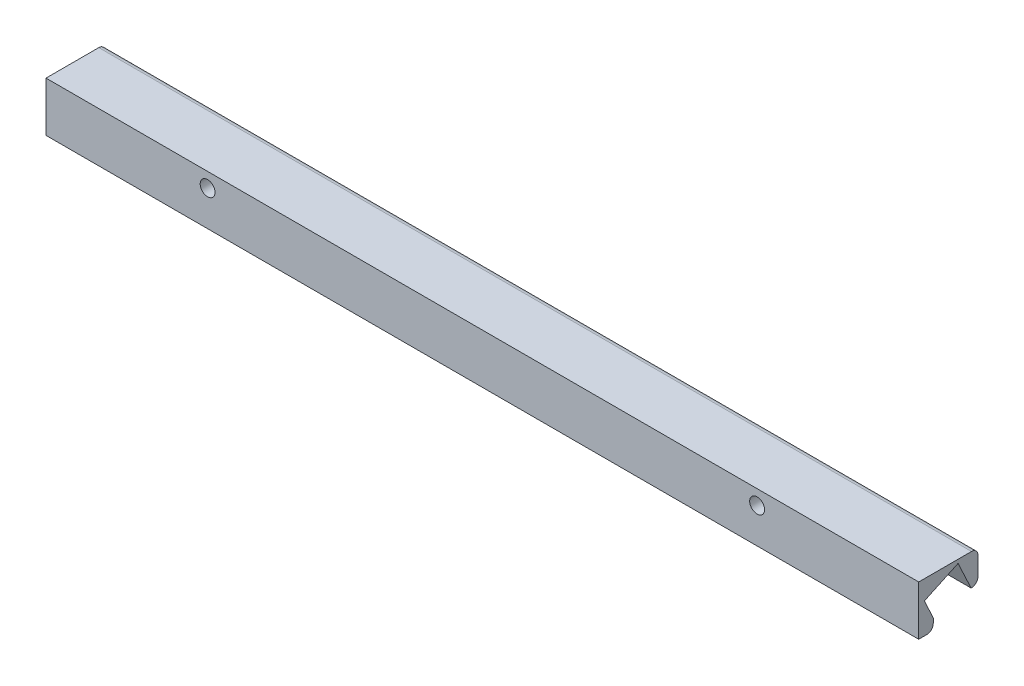
ISO-10303-21;
HEADER;
FILE_DESCRIPTION(('STEP AP214'),'2;1');
FILE_NAME('part.step','',(''),(''),'','','');
FILE_SCHEMA(('AUTOMOTIVE_DESIGN { 1 0 10303 214 1 1 1 1 }'));
ENDSEC;
DATA;
#1=APPLICATION_CONTEXT('core data for automotive mechanical design processes');
#2=APPLICATION_PROTOCOL_DEFINITION('international standard','automotive_design',2000,#1);
#3=PRODUCT_CONTEXT('',#1,'mechanical');
#4=PRODUCT('Part','Part','',(#3));
#5=PRODUCT_RELATED_PRODUCT_CATEGORY('part','',(#4));
#6=PRODUCT_DEFINITION_FORMATION('','',#4);
#7=PRODUCT_DEFINITION_CONTEXT('part definition',#1,'design');
#8=PRODUCT_DEFINITION('design','',#6,#7);
#9=PRODUCT_DEFINITION_SHAPE('','',#8);
#10=(LENGTH_UNIT() NAMED_UNIT(*) SI_UNIT(.MILLI.,.METRE.));
#11=(NAMED_UNIT(*) PLANE_ANGLE_UNIT() SI_UNIT($,.RADIAN.));
#12=(NAMED_UNIT(*) SI_UNIT($,.STERADIAN.) SOLID_ANGLE_UNIT());
#13=UNCERTAINTY_MEASURE_WITH_UNIT(LENGTH_MEASURE(1.E-05),#10,'distance_accuracy_value','');
#14=(GEOMETRIC_REPRESENTATION_CONTEXT(3) GLOBAL_UNCERTAINTY_ASSIGNED_CONTEXT((#13)) GLOBAL_UNIT_ASSIGNED_CONTEXT((#10,
#11,#12)) REPRESENTATION_CONTEXT('',''));
#15=CARTESIAN_POINT('',(0.,0.,0.));
#16=DIRECTION('',(0.,0.,1.));
#17=DIRECTION('',(1.,0.,0.));
#18=AXIS2_PLACEMENT_3D('',#15,#16,#17);
#19=CARTESIAN_POINT('',(270.,15.360110010018,0.));
#20=DIRECTION('',(0.,0.,-1.));
#21=DIRECTION('',(0.,1.,0.));
#22=AXIS2_PLACEMENT_3D('',#19,#20,#21);
#23=PLANE('',#22);
#24=CARTESIAN_POINT('',(50.,10.860110010018,0.));
#25=DIRECTION('',(0.,0.,1.));
#26=DIRECTION('',(1.,0.,0.));
#27=AXIS2_PLACEMENT_3D('',#24,#25,#26);
#28=CIRCLE('',#27,2.3);
#29=CARTESIAN_POINT('',(52.3,10.860110010018,0.));
#30=VERTEX_POINT('',#29);
#31=EDGE_CURVE('E201',#30,#30,#28,.T.);
#32=ORIENTED_EDGE('',*,*,#31,.F.);
#33=EDGE_LOOP('',(#32));
#34=FACE_BOUND('',#33,.T.);
#35=CARTESIAN_POINT('',(220.,10.860110010018,0.));
#36=DIRECTION('',(0.,0.,1.));
#37=DIRECTION('',(1.,0.,0.));
#38=AXIS2_PLACEMENT_3D('',#35,#36,#37);
#39=CIRCLE('',#38,2.30000000000003);
#40=CARTESIAN_POINT('',(222.3,10.860110010018,0.));
#41=VERTEX_POINT('',#40);
#42=EDGE_CURVE('E204',#41,#41,#39,.T.);
#43=ORIENTED_EDGE('',*,*,#42,.F.);
#44=EDGE_LOOP('',(#43));
#45=FACE_BOUND('',#44,.T.);
#46=DIRECTION('',(0.,-1.,0.));
#47=VECTOR('',#46,1.);
#48=CARTESIAN_POINT('',(0.,15.360110010018,0.));
#49=LINE('',#48,#47);
#50=CARTESIAN_POINT('',(0.,15.360110010018,0.));
#51=VERTEX_POINT('',#50);
#52=CARTESIAN_POINT('',(0.,0.,0.));
#53=VERTEX_POINT('',#52);
#54=EDGE_CURVE('E212',#51,#53,#49,.T.);
#55=ORIENTED_EDGE('',*,*,#54,.T.);
#56=DIRECTION('',(-1.,0.,0.));
#57=VECTOR('',#56,1.);
#58=CARTESIAN_POINT('',(270.,0.,0.));
#59=LINE('',#58,#57);
#60=CARTESIAN_POINT('',(270.,0.,0.));
#61=VERTEX_POINT('',#60);
#62=EDGE_CURVE('E11',#61,#53,#59,.T.);
#63=ORIENTED_EDGE('',*,*,#62,.F.);
#64=DIRECTION('',(0.,-1.,0.));
#65=VECTOR('',#64,1.);
#66=CARTESIAN_POINT('',(270.,15.360110010018,0.));
#67=LINE('',#66,#65);
#68=CARTESIAN_POINT('',(270.,15.360110010018,0.));
#69=VERTEX_POINT('',#68);
#70=EDGE_CURVE('E221',#69,#61,#67,.T.);
#71=ORIENTED_EDGE('',*,*,#70,.F.);
#72=DIRECTION('',(-1.,0.,0.));
#73=VECTOR('',#72,1.);
#74=CARTESIAN_POINT('',(270.,15.360110010018,0.));
#75=LINE('',#74,#73);
#76=EDGE_CURVE('E241',#69,#51,#75,.T.);
#77=ORIENTED_EDGE('',*,*,#76,.T.);
#78=EDGE_LOOP('',(#55,#63,#71,#77));
#79=FACE_BOUND('',#78,.T.);
#80=ADVANCED_FACE('F39',(#34,#45,#79),#23,.F.);
#81=CARTESIAN_POINT('',(270.,0.,0.));
#82=DIRECTION('',(0.,1.,0.));
#83=DIRECTION('',(0.,0.,1.));
#84=AXIS2_PLACEMENT_3D('',#81,#82,#83);
#85=PLANE('',#84);
#86=DIRECTION('',(0.,0.,-1.));
#87=VECTOR('',#86,1.);
#88=CARTESIAN_POINT('',(0.,0.,0.));
#89=LINE('',#88,#87);
#90=CARTESIAN_POINT('',(0.,0.,-2.4994615533352));
#91=VERTEX_POINT('',#90);
#92=EDGE_CURVE('E244',#53,#91,#89,.T.);
#93=ORIENTED_EDGE('',*,*,#92,.T.);
#94=DIRECTION('',(-1.,0.,0.));
#95=VECTOR('',#94,1.);
#96=CARTESIAN_POINT('',(270.,0.,-2.4994615533352));
#97=LINE('',#96,#95);
#98=CARTESIAN_POINT('',(270.,0.,-2.4994615533352));
#99=VERTEX_POINT('',#98);
#100=EDGE_CURVE('E46',#99,#91,#97,.T.);
#101=ORIENTED_EDGE('',*,*,#100,.F.);
#102=DIRECTION('',(0.,0.,-1.));
#103=VECTOR('',#102,1.);
#104=CARTESIAN_POINT('',(270.,0.,0.));
#105=LINE('',#104,#103);
#106=EDGE_CURVE('E224',#61,#99,#105,.T.);
#107=ORIENTED_EDGE('',*,*,#106,.F.);
#108=ORIENTED_EDGE('',*,*,#62,.T.);
#109=EDGE_LOOP('',(#93,#101,#107,#108));
#110=FACE_BOUND('',#109,.T.);
#111=ADVANCED_FACE('F307',(#110),#85,.F.);
#112=CARTESIAN_POINT('',(270.,2.0005384466648,-2.4994615533352));
#113=DIRECTION('',(-1.,0.,0.));
#114=DIRECTION('',(0.,0.,1.));
#115=AXIS2_PLACEMENT_3D('',#112,#113,#114);
#116=CYLINDRICAL_SURFACE('',#115,2.0005384466648);
#117=CARTESIAN_POINT('',(0.,2.0005384466648,-2.4994615533352));
#118=DIRECTION('',(1.,0.,0.));
#119=DIRECTION('',(0.,0.,-1.));
#120=AXIS2_PLACEMENT_3D('',#117,#118,#119);
#121=CIRCLE('',#120,2.0005384466648);
#122=CARTESIAN_POINT('',(0.,2.0005384466648,-4.5));
#123=VERTEX_POINT('',#122);
#124=EDGE_CURVE('E246',#91,#123,#121,.T.);
#125=ORIENTED_EDGE('',*,*,#124,.T.);
#126=DIRECTION('',(-1.,0.,0.));
#127=VECTOR('',#126,1.);
#128=CARTESIAN_POINT('',(270.,2.0005384466648,-4.5));
#129=LINE('',#128,#127);
#130=CARTESIAN_POINT('',(270.,2.0005384466648,-4.5));
#131=VERTEX_POINT('',#130);
#132=EDGE_CURVE('E280',#131,#123,#129,.T.);
#133=ORIENTED_EDGE('',*,*,#132,.F.);
#134=CARTESIAN_POINT('',(270.,2.0005384466648,-2.4994615533352));
#135=DIRECTION('',(1.,0.,0.));
#136=DIRECTION('',(0.,0.,-1.));
#137=AXIS2_PLACEMENT_3D('',#134,#135,#136);
#138=CIRCLE('',#137,2.0005384466648);
#139=EDGE_CURVE('E227',#99,#131,#138,.T.);
#140=ORIENTED_EDGE('',*,*,#139,.F.);
#141=ORIENTED_EDGE('',*,*,#100,.T.);
#142=EDGE_LOOP('',(#125,#133,#140,#141));
#143=FACE_BOUND('',#142,.T.);
#144=ADVANCED_FACE('F287',(#143),#116,.T.);
#145=CARTESIAN_POINT('',(270.,3.5,-4.5));
#146=DIRECTION('',(0.,0.,1.));
#147=DIRECTION('',(0.,-1.,0.));
#148=AXIS2_PLACEMENT_3D('',#145,#146,#147);
#149=PLANE('',#148);
#150=DIRECTION('',(0.,1.,0.));
#151=VECTOR('',#150,1.);
#152=CARTESIAN_POINT('',(0.,3.5,-4.5));
#153=LINE('',#152,#151);
#154=CARTESIAN_POINT('',(0.,3.5,-4.5));
#155=VERTEX_POINT('',#154);
#156=EDGE_CURVE('E248',#123,#155,#153,.T.);
#157=ORIENTED_EDGE('',*,*,#156,.T.);
#158=DIRECTION('',(-1.,0.,0.));
#159=VECTOR('',#158,1.);
#160=CARTESIAN_POINT('',(0.,3.5,-4.5));
#161=LINE('',#160,#159);
#162=CARTESIAN_POINT('',(28.,3.5,-4.5));
#163=VERTEX_POINT('',#162);
#164=EDGE_CURVE('E185',#163,#155,#161,.T.);
#165=ORIENTED_EDGE('',*,*,#164,.F.);
#166=DIRECTION('',(-1.,0.,0.));
#167=VECTOR('',#166,1.);
#168=CARTESIAN_POINT('',(270.,3.5,-4.5));
#169=LINE('',#168,#167);
#170=CARTESIAN_POINT('',(242.,3.5,-4.5));
#171=VERTEX_POINT('',#170);
#172=EDGE_CURVE('E276',#171,#163,#169,.T.);
#173=ORIENTED_EDGE('',*,*,#172,.F.);
#174=CARTESIAN_POINT('',(270.,3.5,-4.5));
#175=VERTEX_POINT('',#174);
#176=EDGE_CURVE('E277',#175,#171,#169,.T.);
#177=ORIENTED_EDGE('',*,*,#176,.F.);
#178=DIRECTION('',(0.,1.,0.));
#179=VECTOR('',#178,1.);
#180=CARTESIAN_POINT('',(270.,3.5,-4.5));
#181=LINE('',#180,#179);
#182=EDGE_CURVE('E229',#131,#175,#181,.T.);
#183=ORIENTED_EDGE('',*,*,#182,.F.);
#184=ORIENTED_EDGE('',*,*,#132,.T.);
#185=EDGE_LOOP('',(#157,#165,#173,#177,#183,#184));
#186=FACE_BOUND('',#185,.T.);
#187=ADVANCED_FACE('F297',(#186),#149,.F.);
#188=CARTESIAN_POINT('',(270.,8.36011001001802,-14.9225395509215));
#189=DIRECTION('',(0.,0.906307787036651,0.422618261740697));
#190=DIRECTION('',(0.,-0.422618261740697,0.906307787036651));
#191=AXIS2_PLACEMENT_3D('',#188,#189,#190);
#192=PLANE('',#191);
#193=CARTESIAN_POINT('',(36.15,5.16401056189004,-8.0684821657742));
#194=DIRECTION('',(0.,-0.906307787036651,-0.422618261740697));
#195=DIRECTION('',(0.,0.422618261740697,-0.906307787036651));
#196=AXIS2_PLACEMENT_3D('',#193,#194,#195);
#197=CIRCLE('',#196,2.3);
#198=CARTESIAN_POINT('',(36.15,6.13603256389364,-10.1529900759585));
#199=VERTEX_POINT('',#198);
#200=EDGE_CURVE('E213',#199,#199,#197,.T.);
#201=ORIENTED_EDGE('',*,*,#200,.F.);
#202=EDGE_LOOP('',(#201));
#203=FACE_BOUND('',#202,.T.);
#204=CARTESIAN_POINT('',(233.85,5.93005500500901,-9.71126977546074));
#205=DIRECTION('',(0.,-0.906307787036651,-0.422618261740697));
#206=DIRECTION('',(0.,0.422618261740697,-0.906307787036651));
#207=AXIS2_PLACEMENT_3D('',#204,#205,#206);
#208=CIRCLE('',#207,2.30000000000003);
#209=CARTESIAN_POINT('',(233.85,6.90207700701263,-11.7957776856451));
#210=VERTEX_POINT('',#209);
#211=EDGE_CURVE('E216',#210,#210,#208,.T.);
#212=ORIENTED_EDGE('',*,*,#211,.F.);
#213=EDGE_LOOP('',(#212));
#214=FACE_BOUND('',#213,.T.);
#215=DIRECTION('',(-1.,0.,0.));
#216=VECTOR('',#215,1.);
#217=CARTESIAN_POINT('',(270.,8.36011001001802,-14.9225395509215));
#218=LINE('',#217,#216);
#219=CARTESIAN_POINT('',(242.,8.36011001001802,-14.9225395509215));
#220=VERTEX_POINT('',#219);
#221=CARTESIAN_POINT('',(28.,8.36011001001802,-14.9225395509215));
#222=VERTEX_POINT('',#221);
#223=EDGE_CURVE('E274',#220,#222,#218,.T.);
#224=ORIENTED_EDGE('',*,*,#223,.F.);
#225=DIRECTION('',(0.,0.422618261740697,-0.906307787036651));
#226=VECTOR('',#225,1.);
#227=CARTESIAN_POINT('',(242.,3.5,-4.5));
#228=LINE('',#227,#226);
#229=EDGE_CURVE('E154',#171,#220,#228,.T.);
#230=ORIENTED_EDGE('',*,*,#229,.F.);
#231=ORIENTED_EDGE('',*,*,#172,.T.);
#232=DIRECTION('',(0.,-0.422618261740697,0.906307787036651));
#233=VECTOR('',#232,1.);
#234=CARTESIAN_POINT('',(28.,3.5,-4.5));
#235=LINE('',#234,#233);
#236=EDGE_CURVE('E169',#222,#163,#235,.T.);
#237=ORIENTED_EDGE('',*,*,#236,.F.);
#238=EDGE_LOOP('',(#224,#230,#231,#237));
#239=FACE_BOUND('',#238,.T.);
#240=ADVANCED_FACE('F399',(#203,#214,#239),#192,.F.);
#241=CARTESIAN_POINT('',(270.,5.64118664890806,-16.1903943361436));
#242=DIRECTION('',(0.,0.422618261740698,-0.906307787036651));
#243=DIRECTION('',(0.,0.906307787036651,0.422618261740698));
#244=AXIS2_PLACEMENT_3D('',#241,#242,#243);
#245=PLANE('',#244);
#246=DIRECTION('',(0.,-0.906307787036651,-0.422618261740698));
#247=VECTOR('',#246,1.);
#248=CARTESIAN_POINT('',(0.,5.64118664890806,-16.1903943361436));
#249=LINE('',#248,#247);
#250=CARTESIAN_POINT('',(0.,14.2511106257563,-12.175520849607));
#251=VERTEX_POINT('',#250);
#252=CARTESIAN_POINT('',(0.,5.64118664890806,-16.1903943361436));
#253=VERTEX_POINT('',#252);
#254=EDGE_CURVE('E251',#251,#253,#249,.T.);
#255=ORIENTED_EDGE('',*,*,#254,.T.);
#256=DIRECTION('',(-1.,0.,0.));
#257=VECTOR('',#256,1.);
#258=CARTESIAN_POINT('',(270.,5.64118664890806,-16.1903943361436));
#259=LINE('',#258,#257);
#260=CARTESIAN_POINT('',(270.,5.64118664890806,-16.1903943361436));
#261=VERTEX_POINT('',#260);
#262=EDGE_CURVE('E271',#261,#253,#259,.T.);
#263=ORIENTED_EDGE('',*,*,#262,.F.);
#264=DIRECTION('',(0.,-0.906307787036651,-0.422618261740698));
#265=VECTOR('',#264,1.);
#266=CARTESIAN_POINT('',(270.,5.64118664890806,-16.1903943361436));
#267=LINE('',#266,#265);
#268=CARTESIAN_POINT('',(270.,14.2511106257563,-12.175520849607));
#269=VERTEX_POINT('',#268);
#270=EDGE_CURVE('E53',#269,#261,#267,.T.);
#271=ORIENTED_EDGE('',*,*,#270,.F.);
#272=DIRECTION('',(1.,0.,0.));
#273=VECTOR('',#272,1.);
#274=CARTESIAN_POINT('',(242.,14.2511106257563,-12.175520849607));
#275=LINE('',#274,#273);
#276=CARTESIAN_POINT('',(242.,14.2511106257563,-12.175520849607));
#277=VERTEX_POINT('',#276);
#278=EDGE_CURVE('E160',#277,#269,#275,.T.);
#279=ORIENTED_EDGE('',*,*,#278,.F.);
#280=DIRECTION('',(0.,-0.906307787036651,-0.422618261740697));
#281=VECTOR('',#280,1.);
#282=CARTESIAN_POINT('',(242.,14.2511106257563,-12.175520849607));
#283=LINE('',#282,#281);
#284=EDGE_CURVE('E148',#277,#220,#283,.T.);
#285=ORIENTED_EDGE('',*,*,#284,.T.);
#286=ORIENTED_EDGE('',*,*,#223,.T.);
#287=DIRECTION('',(0.,-0.906307787036651,-0.422618261740697));
#288=VECTOR('',#287,1.);
#289=CARTESIAN_POINT('',(28.,14.2511106257563,-12.175520849607));
#290=LINE('',#289,#288);
#291=CARTESIAN_POINT('',(28.,14.2511106257563,-12.175520849607));
#292=VERTEX_POINT('',#291);
#293=EDGE_CURVE('E178',#292,#222,#290,.T.);
#294=ORIENTED_EDGE('',*,*,#293,.F.);
#295=DIRECTION('',(1.,0.,0.));
#296=VECTOR('',#295,1.);
#297=CARTESIAN_POINT('',(0.,14.2511106257563,-12.175520849607));
#298=LINE('',#297,#296);
#299=EDGE_CURVE('E193',#251,#292,#298,.T.);
#300=ORIENTED_EDGE('',*,*,#299,.F.);
#301=EDGE_LOOP('',(#255,#263,#271,#279,#285,#286,#294,#300));
#302=FACE_BOUND('',#301,.T.);
#303=ADVANCED_FACE('F161',(#302),#245,.F.);
#304=CARTESIAN_POINT('',(270.,7.63552847711335,-16.3407295358501));
#305=DIRECTION('',(-1.,0.,0.));
#306=DIRECTION('',(0.,0.,1.));
#307=AXIS2_PLACEMENT_3D('',#304,#305,#306);
#308=CYLINDRICAL_SURFACE('',#307,2.);
#309=CARTESIAN_POINT('',(0.,7.63552847711335,-16.3407295358501));
#310=DIRECTION('',(1.,0.,0.));
#311=DIRECTION('',(0.,0.,-1.));
#312=AXIS2_PLACEMENT_3D('',#309,#310,#311);
#313=CIRCLE('',#312,2.);
#314=CARTESIAN_POINT('',(0.,7.63552847711335,-18.3407295358501));
#315=VERTEX_POINT('',#314);
#316=EDGE_CURVE('E253',#253,#315,#313,.T.);
#317=ORIENTED_EDGE('',*,*,#316,.T.);
#318=DIRECTION('',(-1.,0.,0.));
#319=VECTOR('',#318,1.);
#320=CARTESIAN_POINT('',(270.,7.63552847711335,-18.3407295358501));
#321=LINE('',#320,#319);
#322=CARTESIAN_POINT('',(270.,7.63552847711335,-18.3407295358501));
#323=VERTEX_POINT('',#322);
#324=EDGE_CURVE('E268',#323,#315,#321,.T.);
#325=ORIENTED_EDGE('',*,*,#324,.F.);
#326=CARTESIAN_POINT('',(270.,7.63552847711335,-16.3407295358501));
#327=DIRECTION('',(1.,0.,0.));
#328=DIRECTION('',(0.,0.,-1.));
#329=AXIS2_PLACEMENT_3D('',#326,#327,#328);
#330=CIRCLE('',#329,2.);
#331=EDGE_CURVE('E233',#261,#323,#330,.T.);
#332=ORIENTED_EDGE('',*,*,#331,.F.);
#333=ORIENTED_EDGE('',*,*,#262,.T.);
#334=EDGE_LOOP('',(#317,#325,#332,#333));
#335=FACE_BOUND('',#334,.T.);
#336=ADVANCED_FACE('F328',(#335),#308,.T.);
#337=CARTESIAN_POINT('',(270.,7.63552847711335,-18.3407295358501));
#338=DIRECTION('',(0.,0.,1.));
#339=DIRECTION('',(0.,-1.,0.));
#340=AXIS2_PLACEMENT_3D('',#337,#338,#339);
#341=PLANE('',#340);
#342=DIRECTION('',(0.,1.,0.));
#343=VECTOR('',#342,1.);
#344=CARTESIAN_POINT('',(0.,7.63552847711335,-18.3407295358501));
#345=LINE('',#344,#343);
#346=CARTESIAN_POINT('',(0.,13.360110010018,-18.3407295358501));
#347=VERTEX_POINT('',#346);
#348=EDGE_CURVE('E255',#315,#347,#345,.T.);
#349=ORIENTED_EDGE('',*,*,#348,.T.);
#350=DIRECTION('',(-1.,0.,0.));
#351=VECTOR('',#350,1.);
#352=CARTESIAN_POINT('',(270.,13.360110010018,-18.3407295358501));
#353=LINE('',#352,#351);
#354=CARTESIAN_POINT('',(270.,13.360110010018,-18.3407295358501));
#355=VERTEX_POINT('',#354);
#356=EDGE_CURVE('E265',#355,#347,#353,.T.);
#357=ORIENTED_EDGE('',*,*,#356,.F.);
#358=DIRECTION('',(0.,1.,0.));
#359=VECTOR('',#358,1.);
#360=CARTESIAN_POINT('',(270.,7.63552847711335,-18.3407295358501));
#361=LINE('',#360,#359);
#362=EDGE_CURVE('E235',#323,#355,#361,.T.);
#363=ORIENTED_EDGE('',*,*,#362,.F.);
#364=ORIENTED_EDGE('',*,*,#324,.T.);
#365=EDGE_LOOP('',(#349,#357,#363,#364));
#366=FACE_BOUND('',#365,.T.);
#367=ADVANCED_FACE('F323',(#366),#341,.F.);
#368=CARTESIAN_POINT('',(270.,13.360110010018,-16.3407295358501));
#369=DIRECTION('',(-1.,0.,0.));
#370=DIRECTION('',(0.,0.,1.));
#371=AXIS2_PLACEMENT_3D('',#368,#369,#370);
#372=CYLINDRICAL_SURFACE('',#371,2.);
#373=CARTESIAN_POINT('',(0.,13.360110010018,-16.3407295358501));
#374=DIRECTION('',(1.,0.,0.));
#375=DIRECTION('',(0.,0.,1.));
#376=AXIS2_PLACEMENT_3D('',#373,#374,#375);
#377=CIRCLE('',#376,2.);
#378=CARTESIAN_POINT('',(0.,15.360110010018,-16.3407295358501));
#379=VERTEX_POINT('',#378);
#380=EDGE_CURVE('E257',#347,#379,#377,.T.);
#381=ORIENTED_EDGE('',*,*,#380,.T.);
#382=DIRECTION('',(-1.,0.,0.));
#383=VECTOR('',#382,1.);
#384=CARTESIAN_POINT('',(270.,15.360110010018,-16.3407295358501));
#385=LINE('',#384,#383);
#386=CARTESIAN_POINT('',(270.,15.360110010018,-16.3407295358501));
#387=VERTEX_POINT('',#386);
#388=EDGE_CURVE('E262',#387,#379,#385,.T.);
#389=ORIENTED_EDGE('',*,*,#388,.F.);
#390=CARTESIAN_POINT('',(270.,13.360110010018,-16.3407295358501));
#391=DIRECTION('',(1.,0.,0.));
#392=DIRECTION('',(0.,0.,1.));
#393=AXIS2_PLACEMENT_3D('',#390,#391,#392);
#394=CIRCLE('',#393,2.);
#395=EDGE_CURVE('E237',#355,#387,#394,.T.);
#396=ORIENTED_EDGE('',*,*,#395,.F.);
#397=ORIENTED_EDGE('',*,*,#356,.T.);
#398=EDGE_LOOP('',(#381,#389,#396,#397));
#399=FACE_BOUND('',#398,.T.);
#400=ADVANCED_FACE('F319',(#399),#372,.T.);
#401=CARTESIAN_POINT('',(270.,15.360110010018,-16.3407295358501));
#402=DIRECTION('',(0.,-1.,0.));
#403=DIRECTION('',(0.,0.,-1.));
#404=AXIS2_PLACEMENT_3D('',#401,#402,#403);
#405=PLANE('',#404);
#406=DIRECTION('',(0.,0.,1.));
#407=VECTOR('',#406,1.);
#408=CARTESIAN_POINT('',(0.,15.360110010018,-16.3407295358501));
#409=LINE('',#408,#407);
#410=EDGE_CURVE('E225',#379,#51,#409,.T.);
#411=ORIENTED_EDGE('',*,*,#410,.T.);
#412=ORIENTED_EDGE('',*,*,#76,.F.);
#413=DIRECTION('',(0.,0.,1.));
#414=VECTOR('',#413,1.);
#415=CARTESIAN_POINT('',(270.,15.360110010018,-16.3407295358501));
#416=LINE('',#415,#414);
#417=EDGE_CURVE('E239',#387,#69,#416,.T.);
#418=ORIENTED_EDGE('',*,*,#417,.F.);
#419=ORIENTED_EDGE('',*,*,#388,.T.);
#420=EDGE_LOOP('',(#411,#412,#418,#419));
#421=FACE_BOUND('',#420,.T.);
#422=ADVANCED_FACE('F314',(#421),#405,.F.);
#423=CARTESIAN_POINT('',(270.,2.0005384466648,-2.4994615533352));
#424=DIRECTION('',(1.,0.,0.));
#425=DIRECTION('',(0.,0.,-1.));
#426=AXIS2_PLACEMENT_3D('',#423,#424,#425);
#427=PLANE('',#426);
#428=DIRECTION('',(0.,-0.906307787036651,-0.422618261740697));
#429=VECTOR('',#428,1.);
#430=CARTESIAN_POINT('',(270.,9.39100061573824,-1.75298129868547));
#431=LINE('',#430,#429);
#432=CARTESIAN_POINT('',(270.,9.39100061573824,-1.75298129868547));
#433=VERTEX_POINT('',#432);
#434=EDGE_CURVE('E157',#433,#175,#431,.T.);
#435=ORIENTED_EDGE('',*,*,#434,.F.);
#436=DIRECTION('',(0.,-0.422618261740697,0.906307787036651));
#437=VECTOR('',#436,1.);
#438=CARTESIAN_POINT('',(270.,9.39100061573824,-1.75298129868547));
#439=LINE('',#438,#437);
#440=EDGE_CURVE('E164',#269,#433,#439,.T.);
#441=ORIENTED_EDGE('',*,*,#440,.F.);
#442=ORIENTED_EDGE('',*,*,#270,.T.);
#443=ORIENTED_EDGE('',*,*,#331,.T.);
#444=ORIENTED_EDGE('',*,*,#362,.T.);
#445=ORIENTED_EDGE('',*,*,#395,.T.);
#446=ORIENTED_EDGE('',*,*,#417,.T.);
#447=ORIENTED_EDGE('',*,*,#70,.T.);
#448=ORIENTED_EDGE('',*,*,#106,.T.);
#449=ORIENTED_EDGE('',*,*,#139,.T.);
#450=ORIENTED_EDGE('',*,*,#182,.T.);
#451=EDGE_LOOP('',(#435,#441,#442,#443,#444,#445,#446,#447,#448,#449,#450));
#452=FACE_BOUND('',#451,.T.);
#453=ADVANCED_FACE('F304',(#452),#427,.T.);
#454=CARTESIAN_POINT('',(0.,2.0005384466648,-2.4994615533352));
#455=DIRECTION('',(1.,0.,0.));
#456=DIRECTION('',(0.,0.,-1.));
#457=AXIS2_PLACEMENT_3D('',#454,#455,#456);
#458=PLANE('',#457);
#459=DIRECTION('',(0.,0.422618261740697,-0.906307787036651));
#460=VECTOR('',#459,1.);
#461=CARTESIAN_POINT('',(0.,9.39100061573824,-1.75298129868547));
#462=LINE('',#461,#460);
#463=CARTESIAN_POINT('',(0.,9.39100061573824,-1.75298129868547));
#464=VERTEX_POINT('',#463);
#465=EDGE_CURVE('E187',#464,#251,#462,.T.);
#466=ORIENTED_EDGE('',*,*,#465,.F.);
#467=DIRECTION('',(0.,-0.906307787036651,-0.422618261740697));
#468=VECTOR('',#467,1.);
#469=CARTESIAN_POINT('',(0.,9.39100061573824,-1.75298129868547));
#470=LINE('',#469,#468);
#471=EDGE_CURVE('E182',#464,#155,#470,.T.);
#472=ORIENTED_EDGE('',*,*,#471,.T.);
#473=ORIENTED_EDGE('',*,*,#156,.F.);
#474=ORIENTED_EDGE('',*,*,#124,.F.);
#475=ORIENTED_EDGE('',*,*,#92,.F.);
#476=ORIENTED_EDGE('',*,*,#54,.F.);
#477=ORIENTED_EDGE('',*,*,#410,.F.);
#478=ORIENTED_EDGE('',*,*,#380,.F.);
#479=ORIENTED_EDGE('',*,*,#348,.F.);
#480=ORIENTED_EDGE('',*,*,#316,.F.);
#481=ORIENTED_EDGE('',*,*,#254,.F.);
#482=EDGE_LOOP('',(#466,#472,#473,#474,#475,#476,#477,#478,#479,#480,#481));
#483=FACE_BOUND('',#482,.T.);
#484=ADVANCED_FACE('F293',(#483),#458,.F.);
#485=CARTESIAN_POINT('',(233.85,10.0084400466739,-7.80948759762761));
#486=DIRECTION('',(0.,-0.906307787036651,-0.422618261740697));
#487=DIRECTION('',(0.,0.422618261740697,-0.906307787036651));
#488=AXIS2_PLACEMENT_3D('',#485,#486,#487);
#489=CYLINDRICAL_SURFACE('',#488,2.30000000000003);
#490=CARTESIAN_POINT('',(233.85,10.0084400466739,-7.80948759762761));
#491=DIRECTION('',(0.,-0.906307787036651,-0.422618261740697));
#492=DIRECTION('',(0.,0.422618261740697,-0.906307787036651));
#493=AXIS2_PLACEMENT_3D('',#490,#491,#492);
#494=CIRCLE('',#493,2.30000000000003);
#495=CARTESIAN_POINT('',(233.85,10.9804620486776,-9.89399550781194));
#496=VERTEX_POINT('',#495);
#497=EDGE_CURVE('E200',#496,#496,#494,.T.);
#498=ORIENTED_EDGE('',*,*,#497,.F.);
#499=EDGE_LOOP('',(#498));
#500=FACE_BOUND('',#499,.T.);
#501=ORIENTED_EDGE('',*,*,#211,.T.);
#502=EDGE_LOOP('',(#501));
#503=FACE_BOUND('',#502,.T.);
#504=ADVANCED_FACE('F378',(#500,#503),#489,.F.);
#505=CARTESIAN_POINT('',(233.85,10.0084400466739,-7.80948759762761));
#506=DIRECTION('',(0.,-0.906307787036651,-0.422618261740697));
#507=DIRECTION('',(0.,0.422618261740697,-0.906307787036651));
#508=AXIS2_PLACEMENT_3D('',#505,#506,#507);
#509=PLANE('',#508);
#510=ORIENTED_EDGE('',*,*,#497,.T.);
#511=EDGE_LOOP('',(#510));
#512=FACE_BOUND('',#511,.T.);
#513=ADVANCED_FACE('F376',(#512),#509,.T.);
#514=CARTESIAN_POINT('',(36.15,9.24239560355497,-6.16669998794106));
#515=DIRECTION('',(0.,-0.906307787036651,-0.422618261740697));
#516=DIRECTION('',(0.,0.422618261740697,-0.906307787036651));
#517=AXIS2_PLACEMENT_3D('',#514,#515,#516);
#518=CYLINDRICAL_SURFACE('',#517,2.3);
#519=CARTESIAN_POINT('',(36.15,9.24239560355497,-6.16669998794106));
#520=DIRECTION('',(0.,-0.906307787036651,-0.422618261740697));
#521=DIRECTION('',(0.,0.422618261740697,-0.906307787036651));
#522=AXIS2_PLACEMENT_3D('',#519,#520,#521);
#523=CIRCLE('',#522,2.3);
#524=CARTESIAN_POINT('',(36.15,10.2144176055586,-8.25120789812536));
#525=VERTEX_POINT('',#524);
#526=EDGE_CURVE('E209',#525,#525,#523,.T.);
#527=ORIENTED_EDGE('',*,*,#526,.F.);
#528=EDGE_LOOP('',(#527));
#529=FACE_BOUND('',#528,.T.);
#530=ORIENTED_EDGE('',*,*,#200,.T.);
#531=EDGE_LOOP('',(#530));
#532=FACE_BOUND('',#531,.T.);
#533=ADVANCED_FACE('F368',(#529,#532),#518,.F.);
#534=CARTESIAN_POINT('',(36.15,9.24239560355497,-6.16669998794106));
#535=DIRECTION('',(0.,-0.906307787036651,-0.422618261740697));
#536=DIRECTION('',(0.,0.422618261740697,-0.906307787036651));
#537=AXIS2_PLACEMENT_3D('',#534,#535,#536);
#538=PLANE('',#537);
#539=ORIENTED_EDGE('',*,*,#526,.T.);
#540=EDGE_LOOP('',(#539));
#541=FACE_BOUND('',#540,.T.);
#542=ADVANCED_FACE('F359',(#541),#538,.T.);
#543=CARTESIAN_POINT('',(220.,10.860110010018,-4.5));
#544=DIRECTION('',(0.,0.,1.));
#545=DIRECTION('',(1.,0.,0.));
#546=AXIS2_PLACEMENT_3D('',#543,#544,#545);
#547=CYLINDRICAL_SURFACE('',#546,2.30000000000003);
#548=CARTESIAN_POINT('',(220.,10.860110010018,-4.5));
#549=DIRECTION('',(0.,0.,1.));
#550=DIRECTION('',(1.,0.,0.));
#551=AXIS2_PLACEMENT_3D('',#548,#549,#550);
#552=CIRCLE('',#551,2.30000000000003);
#553=CARTESIAN_POINT('',(222.3,10.860110010018,-4.5));
#554=VERTEX_POINT('',#553);
#555=EDGE_CURVE('E176',#554,#554,#552,.T.);
#556=ORIENTED_EDGE('',*,*,#555,.F.);
#557=EDGE_LOOP('',(#556));
#558=FACE_BOUND('',#557,.T.);
#559=ORIENTED_EDGE('',*,*,#42,.T.);
#560=EDGE_LOOP('',(#559));
#561=FACE_BOUND('',#560,.T.);
#562=ADVANCED_FACE('F357',(#558,#561),#547,.F.);
#563=CARTESIAN_POINT('',(220.,10.860110010018,-4.5));
#564=DIRECTION('',(0.,0.,1.));
#565=DIRECTION('',(1.,0.,0.));
#566=AXIS2_PLACEMENT_3D('',#563,#564,#565);
#567=PLANE('',#566);
#568=ORIENTED_EDGE('',*,*,#555,.T.);
#569=EDGE_LOOP('',(#568));
#570=FACE_BOUND('',#569,.T.);
#571=ADVANCED_FACE('F358',(#570),#567,.T.);
#572=CARTESIAN_POINT('',(50.,10.860110010018,-4.5));
#573=DIRECTION('',(0.,0.,1.));
#574=DIRECTION('',(1.,0.,0.));
#575=AXIS2_PLACEMENT_3D('',#572,#573,#574);
#576=CYLINDRICAL_SURFACE('',#575,2.3);
#577=CARTESIAN_POINT('',(50.,10.860110010018,-4.5));
#578=DIRECTION('',(0.,0.,1.));
#579=DIRECTION('',(1.,0.,0.));
#580=AXIS2_PLACEMENT_3D('',#577,#578,#579);
#581=CIRCLE('',#580,2.3);
#582=CARTESIAN_POINT('',(52.3,10.860110010018,-4.5));
#583=VERTEX_POINT('',#582);
#584=EDGE_CURVE('E197',#583,#583,#581,.T.);
#585=ORIENTED_EDGE('',*,*,#584,.F.);
#586=EDGE_LOOP('',(#585));
#587=FACE_BOUND('',#586,.T.);
#588=ORIENTED_EDGE('',*,*,#31,.T.);
#589=EDGE_LOOP('',(#588));
#590=FACE_BOUND('',#589,.T.);
#591=ADVANCED_FACE('F365',(#587,#590),#576,.F.);
#592=CARTESIAN_POINT('',(50.,10.860110010018,-4.5));
#593=DIRECTION('',(0.,0.,1.));
#594=DIRECTION('',(1.,0.,0.));
#595=AXIS2_PLACEMENT_3D('',#592,#593,#594);
#596=PLANE('',#595);
#597=ORIENTED_EDGE('',*,*,#584,.T.);
#598=EDGE_LOOP('',(#597));
#599=FACE_BOUND('',#598,.T.);
#600=ADVANCED_FACE('F474',(#599),#596,.T.);
#601=CARTESIAN_POINT('',(0.,9.39100061573824,-1.75298129868547));
#602=DIRECTION('',(0.,-0.422618261740697,0.906307787036651));
#603=DIRECTION('',(0.,-0.906307787036651,-0.422618261740697));
#604=AXIS2_PLACEMENT_3D('',#601,#602,#603);
#605=PLANE('',#604);
#606=ORIENTED_EDGE('',*,*,#164,.T.);
#607=ORIENTED_EDGE('',*,*,#471,.F.);
#608=DIRECTION('',(-1.,0.,0.));
#609=VECTOR('',#608,1.);
#610=CARTESIAN_POINT('',(0.,9.39100061573824,-1.75298129868547));
#611=LINE('',#610,#609);
#612=CARTESIAN_POINT('',(28.,9.39100061573824,-1.75298129868547));
#613=VERTEX_POINT('',#612);
#614=EDGE_CURVE('E61',#613,#464,#611,.T.);
#615=ORIENTED_EDGE('',*,*,#614,.F.);
#616=DIRECTION('',(0.,-0.906307787036651,-0.422618261740697));
#617=VECTOR('',#616,1.);
#618=CARTESIAN_POINT('',(28.,9.39100061573824,-1.75298129868547));
#619=LINE('',#618,#617);
#620=EDGE_CURVE('E180',#613,#163,#619,.T.);
#621=ORIENTED_EDGE('',*,*,#620,.T.);
#622=EDGE_LOOP('',(#606,#607,#615,#621));
#623=FACE_BOUND('',#622,.T.);
#624=ADVANCED_FACE('F341',(#623),#605,.F.);
#625=CARTESIAN_POINT('',(28.,9.39100061573824,-1.75298129868547));
#626=DIRECTION('',(1.,0.,0.));
#627=DIRECTION('',(0.,0.,-1.));
#628=AXIS2_PLACEMENT_3D('',#625,#626,#627);
#629=PLANE('',#628);
#630=ORIENTED_EDGE('',*,*,#236,.T.);
#631=ORIENTED_EDGE('',*,*,#620,.F.);
#632=DIRECTION('',(0.,-0.422618261740697,0.906307787036651));
#633=VECTOR('',#632,1.);
#634=CARTESIAN_POINT('',(28.,9.39100061573824,-1.75298129868547));
#635=LINE('',#634,#633);
#636=EDGE_CURVE('E191',#292,#613,#635,.T.);
#637=ORIENTED_EDGE('',*,*,#636,.F.);
#638=ORIENTED_EDGE('',*,*,#293,.T.);
#639=EDGE_LOOP('',(#630,#631,#637,#638));
#640=FACE_BOUND('',#639,.T.);
#641=ADVANCED_FACE('F333',(#640),#629,.F.);
#642=CARTESIAN_POINT('',(0.,7.04227893567199,3.28386859856746));
#643=DIRECTION('',(0.,-0.906307787036651,-0.422618261740697));
#644=DIRECTION('',(0.,0.422618261740697,-0.906307787036651));
#645=AXIS2_PLACEMENT_3D('',#642,#643,#644);
#646=PLANE('',#645);
#647=ORIENTED_EDGE('',*,*,#465,.T.);
#648=ORIENTED_EDGE('',*,*,#299,.T.);
#649=ORIENTED_EDGE('',*,*,#636,.T.);
#650=ORIENTED_EDGE('',*,*,#614,.T.);
#651=EDGE_LOOP('',(#647,#648,#649,#650));
#652=FACE_BOUND('',#651,.T.);
#653=ADVANCED_FACE('F331',(#652),#646,.T.);
#654=CARTESIAN_POINT('',(242.,9.39100061573824,-1.75298129868547));
#655=DIRECTION('',(-1.,0.,0.));
#656=DIRECTION('',(0.,0.,1.));
#657=AXIS2_PLACEMENT_3D('',#654,#655,#656);
#658=PLANE('',#657);
#659=ORIENTED_EDGE('',*,*,#229,.T.);
#660=ORIENTED_EDGE('',*,*,#284,.F.);
#661=DIRECTION('',(0.,0.422618261740697,-0.906307787036651));
#662=VECTOR('',#661,1.);
#663=CARTESIAN_POINT('',(242.,9.39100061573824,-1.75298129868547));
#664=LINE('',#663,#662);
#665=CARTESIAN_POINT('',(242.,9.39100061573824,-1.75298129868547));
#666=VERTEX_POINT('',#665);
#667=EDGE_CURVE('E151',#666,#277,#664,.T.);
#668=ORIENTED_EDGE('',*,*,#667,.F.);
#669=DIRECTION('',(0.,-0.906307787036651,-0.422618261740697));
#670=VECTOR('',#669,1.);
#671=CARTESIAN_POINT('',(242.,9.39100061573824,-1.75298129868547));
#672=LINE('',#671,#670);
#673=EDGE_CURVE('E174',#666,#171,#672,.T.);
#674=ORIENTED_EDGE('',*,*,#673,.T.);
#675=EDGE_LOOP('',(#659,#660,#668,#674));
#676=FACE_BOUND('',#675,.T.);
#677=ADVANCED_FACE('F149',(#676),#658,.F.);
#678=CARTESIAN_POINT('',(242.,9.39100061573824,-1.75298129868547));
#679=DIRECTION('',(0.,-0.422618261740697,0.906307787036651));
#680=DIRECTION('',(0.,-0.906307787036651,-0.422618261740697));
#681=AXIS2_PLACEMENT_3D('',#678,#679,#680);
#682=PLANE('',#681);
#683=ORIENTED_EDGE('',*,*,#176,.T.);
#684=ORIENTED_EDGE('',*,*,#673,.F.);
#685=DIRECTION('',(-1.,0.,0.));
#686=VECTOR('',#685,1.);
#687=CARTESIAN_POINT('',(242.,9.39100061573824,-1.75298129868547));
#688=LINE('',#687,#686);
#689=EDGE_CURVE('E158',#433,#666,#688,.T.);
#690=ORIENTED_EDGE('',*,*,#689,.F.);
#691=ORIENTED_EDGE('',*,*,#434,.T.);
#692=EDGE_LOOP('',(#683,#684,#690,#691));
#693=FACE_BOUND('',#692,.T.);
#694=ADVANCED_FACE('F339',(#693),#682,.F.);
#695=CARTESIAN_POINT('',(0.,7.04227893567199,3.28386859856746));
#696=DIRECTION('',(0.,-0.906307787036651,-0.422618261740697));
#697=DIRECTION('',(0.,0.422618261740697,-0.906307787036651));
#698=AXIS2_PLACEMENT_3D('',#695,#696,#697);
#699=PLANE('',#698);
#700=ORIENTED_EDGE('',*,*,#667,.T.);
#701=ORIENTED_EDGE('',*,*,#278,.T.);
#702=ORIENTED_EDGE('',*,*,#440,.T.);
#703=ORIENTED_EDGE('',*,*,#689,.T.);
#704=EDGE_LOOP('',(#700,#701,#702,#703));
#705=FACE_BOUND('',#704,.T.);
#706=ADVANCED_FACE('F166',(#705),#699,.T.);
#707=CLOSED_SHELL('',(#80,#111,#144,#187,#240,#303,#336,#367,#400,#422,#453,#484,#504,#513,#533,
#542,#562,#571,#591,#600,#624,#641,#653,#677,#694,#706));
#708=MANIFOLD_SOLID_BREP('B2',#707);
#709=ADVANCED_BREP_SHAPE_REPRESENTATION('',(#18,#708),#14);
#710=SHAPE_DEFINITION_REPRESENTATION(#9,#709);
ENDSEC;
END-ISO-10303-21;
